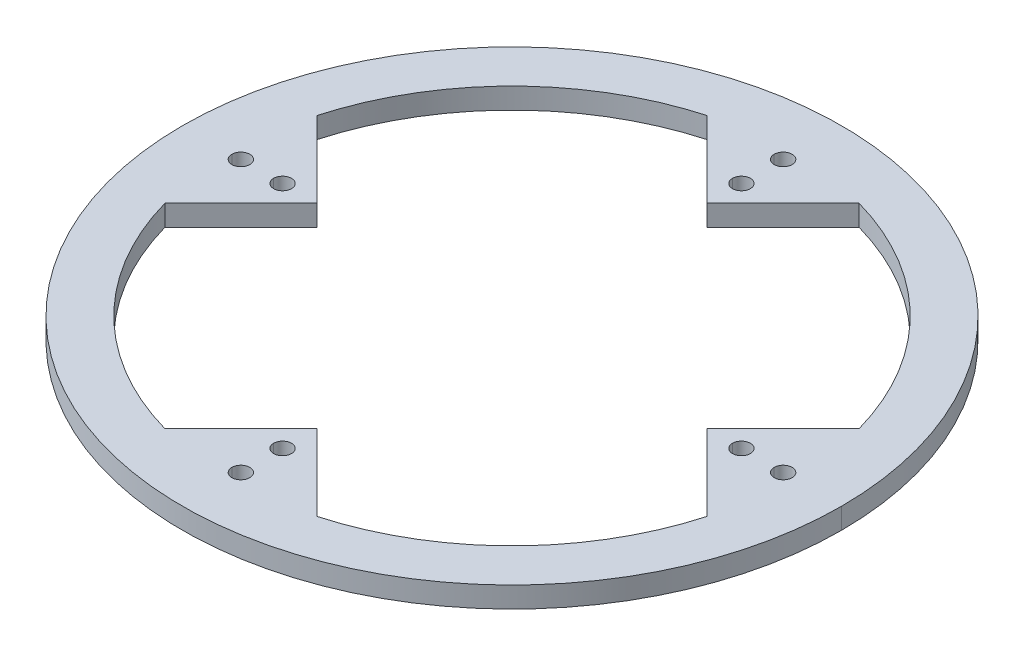
ISO-10303-21;
HEADER;
FILE_DESCRIPTION(('STEP AP214'),'2;1');
FILE_NAME('part.step','',(''),(''),'','','');
FILE_SCHEMA(('AUTOMOTIVE_DESIGN { 1 0 10303 214 1 1 1 1 }'));
ENDSEC;
DATA;
#1=APPLICATION_CONTEXT('core data for automotive mechanical design processes');
#2=APPLICATION_PROTOCOL_DEFINITION('international standard','automotive_design',2000,#1);
#3=PRODUCT_CONTEXT('',#1,'mechanical');
#4=PRODUCT('Part','Part','',(#3));
#5=PRODUCT_RELATED_PRODUCT_CATEGORY('part','',(#4));
#6=PRODUCT_DEFINITION_FORMATION('','',#4);
#7=PRODUCT_DEFINITION_CONTEXT('part definition',#1,'design');
#8=PRODUCT_DEFINITION('design','',#6,#7);
#9=PRODUCT_DEFINITION_SHAPE('','',#8);
#10=(LENGTH_UNIT() NAMED_UNIT(*) SI_UNIT(.MILLI.,.METRE.));
#11=(NAMED_UNIT(*) PLANE_ANGLE_UNIT() SI_UNIT($,.RADIAN.));
#12=(NAMED_UNIT(*) SI_UNIT($,.STERADIAN.) SOLID_ANGLE_UNIT());
#13=UNCERTAINTY_MEASURE_WITH_UNIT(LENGTH_MEASURE(1.E-05),#10,'distance_accuracy_value','');
#14=(GEOMETRIC_REPRESENTATION_CONTEXT(3) GLOBAL_UNCERTAINTY_ASSIGNED_CONTEXT((#13)) GLOBAL_UNIT_ASSIGNED_CONTEXT((#10,
#11,#12)) REPRESENTATION_CONTEXT('',''));
#15=CARTESIAN_POINT('',(0.,0.,0.));
#16=DIRECTION('',(0.,0.,1.));
#17=DIRECTION('',(1.,0.,0.));
#18=AXIS2_PLACEMENT_3D('',#15,#16,#17);
#19=CARTESIAN_POINT('',(65.,0.,-18.2002747232));
#20=DIRECTION('',(-0.707106781186548,0.,-0.707106781186548));
#21=DIRECTION('',(-0.707106781186548,0.,0.707106781186548));
#22=AXIS2_PLACEMENT_3D('',#19,#20,#21);
#23=PLANE('',#22);
#24=DIRECTION('',(0.,1.,0.));
#25=VECTOR('',#24,1.);
#26=CARTESIAN_POINT('',(46.7997252768,0.,0.));
#27=LINE('',#26,#25);
#28=CARTESIAN_POINT('',(46.7997252768,0.,0.));
#29=VERTEX_POINT('',#28);
#30=CARTESIAN_POINT('',(46.7997252768,5.,0.));
#31=VERTEX_POINT('',#30);
#32=EDGE_CURVE('E9',#29,#31,#27,.T.);
#33=ORIENTED_EDGE('',*,*,#32,.T.);
#34=DIRECTION('',(-0.707106781186548,0.,0.707106781186548));
#35=VECTOR('',#34,1.);
#36=CARTESIAN_POINT('',(65.,5.,-18.2002747232));
#37=LINE('',#36,#35);
#38=CARTESIAN_POINT('',(65.,5.,-18.2002747232));
#39=VERTEX_POINT('',#38);
#40=EDGE_CURVE('E281',#39,#31,#37,.T.);
#41=ORIENTED_EDGE('',*,*,#40,.F.);
#42=DIRECTION('',(0.,1.,0.));
#43=VECTOR('',#42,1.);
#44=CARTESIAN_POINT('',(65.,0.,-18.2002747232));
#45=LINE('',#44,#43);
#46=CARTESIAN_POINT('',(65.,0.,-18.2002747232));
#47=VERTEX_POINT('',#46);
#48=EDGE_CURVE('E351',#47,#39,#45,.T.);
#49=ORIENTED_EDGE('',*,*,#48,.F.);
#50=DIRECTION('',(-0.707106781186548,0.,0.707106781186548));
#51=VECTOR('',#50,1.);
#52=CARTESIAN_POINT('',(65.,0.,-18.2002747232));
#53=LINE('',#52,#51);
#54=EDGE_CURVE('E450',#47,#29,#53,.T.);
#55=ORIENTED_EDGE('',*,*,#54,.T.);
#56=EDGE_LOOP('',(#33,#41,#49,#55));
#57=FACE_BOUND('',#56,.T.);
#58=ADVANCED_FACE('F14',(#57),#23,.T.);
#59=CARTESIAN_POINT('',(46.7997252768,0.,0.));
#60=DIRECTION('',(-0.707106781186548,0.,0.707106781186548));
#61=DIRECTION('',(0.,1.,0.));
#62=AXIS2_PLACEMENT_3D('',#59,#60,#61);
#63=PLANE('',#62);
#64=DIRECTION('',(0.,1.,0.));
#65=VECTOR('',#64,1.);
#66=CARTESIAN_POINT('',(65.,0.,18.2002747232));
#67=LINE('',#66,#65);
#68=CARTESIAN_POINT('',(65.,0.,18.2002747232));
#69=VERTEX_POINT('',#68);
#70=CARTESIAN_POINT('',(65.,5.,18.2002747232));
#71=VERTEX_POINT('',#70);
#72=EDGE_CURVE('E25',#69,#71,#67,.T.);
#73=ORIENTED_EDGE('',*,*,#72,.T.);
#74=DIRECTION('',(0.707106781186548,0.,0.707106781186548));
#75=VECTOR('',#74,1.);
#76=CARTESIAN_POINT('',(46.7997252768,5.,0.));
#77=LINE('',#76,#75);
#78=EDGE_CURVE('E258',#31,#71,#77,.T.);
#79=ORIENTED_EDGE('',*,*,#78,.F.);
#80=ORIENTED_EDGE('',*,*,#32,.F.);
#81=DIRECTION('',(0.707106781186548,0.,0.707106781186548));
#82=VECTOR('',#81,1.);
#83=CARTESIAN_POINT('',(46.7997252768,0.,0.));
#84=LINE('',#83,#82);
#85=EDGE_CURVE('E261',#29,#69,#84,.T.);
#86=ORIENTED_EDGE('',*,*,#85,.T.);
#87=EDGE_LOOP('',(#73,#79,#80,#86));
#88=FACE_BOUND('',#87,.T.);
#89=ADVANCED_FACE('F256',(#88),#63,.T.);
#90=CARTESIAN_POINT('',(0.,0.,0.));
#91=DIRECTION('',(0.,1.,0.));
#92=DIRECTION('',(1.,0.,0.));
#93=AXIS2_PLACEMENT_3D('',#90,#91,#92);
#94=CYLINDRICAL_SURFACE('',#93,67.5);
#95=DIRECTION('',(0.,1.,0.));
#96=VECTOR('',#95,1.);
#97=CARTESIAN_POINT('',(18.2002747232,0.,65.));
#98=LINE('',#97,#96);
#99=CARTESIAN_POINT('',(18.2002747232,0.,65.));
#100=VERTEX_POINT('',#99);
#101=CARTESIAN_POINT('',(18.2002747232,5.,65.));
#102=VERTEX_POINT('',#101);
#103=EDGE_CURVE('E266',#100,#102,#98,.T.);
#104=ORIENTED_EDGE('',*,*,#103,.T.);
#105=CARTESIAN_POINT('',(0.,5.,0.));
#106=DIRECTION('',(0.,-1.,0.));
#107=DIRECTION('',(0.962962962962961,0.,0.269633699602989));
#108=AXIS2_PLACEMENT_3D('',#105,#106,#107);
#109=CIRCLE('',#108,67.5);
#110=EDGE_CURVE('E269',#71,#102,#109,.T.);
#111=ORIENTED_EDGE('',*,*,#110,.F.);
#112=ORIENTED_EDGE('',*,*,#72,.F.);
#113=CARTESIAN_POINT('',(0.,0.,0.));
#114=DIRECTION('',(0.,-1.,0.));
#115=DIRECTION('',(0.962962962962961,0.,0.269633699602989));
#116=AXIS2_PLACEMENT_3D('',#113,#114,#115);
#117=CIRCLE('',#116,67.5);
#118=EDGE_CURVE('E485',#69,#100,#117,.T.);
#119=ORIENTED_EDGE('',*,*,#118,.T.);
#120=EDGE_LOOP('',(#104,#111,#112,#119));
#121=FACE_BOUND('',#120,.T.);
#122=ADVANCED_FACE('F270',(#121),#94,.F.);
#123=CARTESIAN_POINT('',(18.2002747232,0.,65.));
#124=DIRECTION('',(0.707106781186548,0.,-0.707106781186548));
#125=DIRECTION('',(0.,-1.,0.));
#126=AXIS2_PLACEMENT_3D('',#123,#124,#125);
#127=PLANE('',#126);
#128=DIRECTION('',(0.,1.,0.));
#129=VECTOR('',#128,1.);
#130=CARTESIAN_POINT('',(0.,0.,46.7997252768));
#131=LINE('',#130,#129);
#132=CARTESIAN_POINT('',(0.,0.,46.7997252768));
#133=VERTEX_POINT('',#132);
#134=CARTESIAN_POINT('',(0.,5.,46.7997252768));
#135=VERTEX_POINT('',#134);
#136=EDGE_CURVE('E440',#133,#135,#131,.T.);
#137=ORIENTED_EDGE('',*,*,#136,.T.);
#138=DIRECTION('',(-0.707106781186548,0.,-0.707106781186548));
#139=VECTOR('',#138,1.);
#140=CARTESIAN_POINT('',(18.2002747232,5.,65.));
#141=LINE('',#140,#139);
#142=EDGE_CURVE('E275',#102,#135,#141,.T.);
#143=ORIENTED_EDGE('',*,*,#142,.F.);
#144=ORIENTED_EDGE('',*,*,#103,.F.);
#145=DIRECTION('',(-0.707106781186548,0.,-0.707106781186548));
#146=VECTOR('',#145,1.);
#147=CARTESIAN_POINT('',(18.2002747232,0.,65.));
#148=LINE('',#147,#146);
#149=EDGE_CURVE('E431',#100,#133,#148,.T.);
#150=ORIENTED_EDGE('',*,*,#149,.T.);
#151=EDGE_LOOP('',(#137,#143,#144,#150));
#152=FACE_BOUND('',#151,.T.);
#153=ADVANCED_FACE('F722',(#152),#127,.T.);
#154=CARTESIAN_POINT('',(0.,0.,46.7997252768));
#155=DIRECTION('',(-0.707106781186548,0.,-0.707106781186548));
#156=DIRECTION('',(-0.707106781186548,0.,0.707106781186548));
#157=AXIS2_PLACEMENT_3D('',#154,#155,#156);
#158=PLANE('',#157);
#159=DIRECTION('',(0.,1.,0.));
#160=VECTOR('',#159,1.);
#161=CARTESIAN_POINT('',(-18.2002747232,0.,65.));
#162=LINE('',#161,#160);
#163=CARTESIAN_POINT('',(-18.2002747232,0.,65.));
#164=VERTEX_POINT('',#163);
#165=CARTESIAN_POINT('',(-18.2002747232,5.,65.));
#166=VERTEX_POINT('',#165);
#167=EDGE_CURVE('E436',#164,#166,#162,.T.);
#168=ORIENTED_EDGE('',*,*,#167,.T.);
#169=DIRECTION('',(-0.707106781186548,0.,0.707106781186548));
#170=VECTOR('',#169,1.);
#171=CARTESIAN_POINT('',(0.,5.,46.7997252768));
#172=LINE('',#171,#170);
#173=EDGE_CURVE('E313',#135,#166,#172,.T.);
#174=ORIENTED_EDGE('',*,*,#173,.F.);
#175=ORIENTED_EDGE('',*,*,#136,.F.);
#176=DIRECTION('',(-0.707106781186548,0.,0.707106781186548));
#177=VECTOR('',#176,1.);
#178=CARTESIAN_POINT('',(0.,0.,46.7997252768));
#179=LINE('',#178,#177);
#180=EDGE_CURVE('E427',#133,#164,#179,.T.);
#181=ORIENTED_EDGE('',*,*,#180,.T.);
#182=EDGE_LOOP('',(#168,#174,#175,#181));
#183=FACE_BOUND('',#182,.T.);
#184=ADVANCED_FACE('F724',(#183),#158,.T.);
#185=CARTESIAN_POINT('',(0.,0.,0.));
#186=DIRECTION('',(0.,1.,0.));
#187=DIRECTION('',(1.,0.,0.));
#188=AXIS2_PLACEMENT_3D('',#185,#186,#187);
#189=CYLINDRICAL_SURFACE('',#188,67.5);
#190=DIRECTION('',(0.,1.,0.));
#191=VECTOR('',#190,1.);
#192=CARTESIAN_POINT('',(-65.,0.,18.2002747232));
#193=LINE('',#192,#191);
#194=CARTESIAN_POINT('',(-65.,0.,18.2002747232));
#195=VERTEX_POINT('',#194);
#196=CARTESIAN_POINT('',(-65.,5.,18.2002747232));
#197=VERTEX_POINT('',#196);
#198=EDGE_CURVE('E433',#195,#197,#193,.T.);
#199=ORIENTED_EDGE('',*,*,#198,.T.);
#200=CARTESIAN_POINT('',(0.,5.,0.));
#201=DIRECTION('',(0.,-1.,0.));
#202=DIRECTION('',(-0.269633699602989,0.,0.962962962962961));
#203=AXIS2_PLACEMENT_3D('',#200,#201,#202);
#204=CIRCLE('',#203,67.5);
#205=EDGE_CURVE('E317',#166,#197,#204,.T.);
#206=ORIENTED_EDGE('',*,*,#205,.F.);
#207=ORIENTED_EDGE('',*,*,#167,.F.);
#208=CARTESIAN_POINT('',(0.,0.,0.));
#209=DIRECTION('',(0.,-1.,0.));
#210=DIRECTION('',(-0.269633699602989,0.,0.962962962962961));
#211=AXIS2_PLACEMENT_3D('',#208,#209,#210);
#212=CIRCLE('',#211,67.5);
#213=EDGE_CURVE('E432',#164,#195,#212,.T.);
#214=ORIENTED_EDGE('',*,*,#213,.T.);
#215=EDGE_LOOP('',(#199,#206,#207,#214));
#216=FACE_BOUND('',#215,.T.);
#217=ADVANCED_FACE('F587',(#216),#189,.F.);
#218=CARTESIAN_POINT('',(-65.,0.,18.2002747232));
#219=DIRECTION('',(0.707106781186548,0.,0.707106781186548));
#220=DIRECTION('',(0.,-1.,0.));
#221=AXIS2_PLACEMENT_3D('',#218,#219,#220);
#222=PLANE('',#221);
#223=DIRECTION('',(0.,1.,0.));
#224=VECTOR('',#223,1.);
#225=CARTESIAN_POINT('',(-46.7997252768,0.,0.));
#226=LINE('',#225,#224);
#227=CARTESIAN_POINT('',(-46.7997252768,0.,0.));
#228=VERTEX_POINT('',#227);
#229=CARTESIAN_POINT('',(-46.7997252768,5.,0.));
#230=VERTEX_POINT('',#229);
#231=EDGE_CURVE('E437',#228,#230,#226,.T.);
#232=ORIENTED_EDGE('',*,*,#231,.T.);
#233=DIRECTION('',(0.707106781186548,0.,-0.707106781186548));
#234=VECTOR('',#233,1.);
#235=CARTESIAN_POINT('',(-65.,5.,18.2002747232));
#236=LINE('',#235,#234);
#237=EDGE_CURVE('E412',#197,#230,#236,.T.);
#238=ORIENTED_EDGE('',*,*,#237,.F.);
#239=ORIENTED_EDGE('',*,*,#198,.F.);
#240=DIRECTION('',(0.707106781186548,0.,-0.707106781186548));
#241=VECTOR('',#240,1.);
#242=CARTESIAN_POINT('',(-65.,0.,18.2002747232));
#243=LINE('',#242,#241);
#244=EDGE_CURVE('E374',#195,#228,#243,.T.);
#245=ORIENTED_EDGE('',*,*,#244,.T.);
#246=EDGE_LOOP('',(#232,#238,#239,#245));
#247=FACE_BOUND('',#246,.T.);
#248=ADVANCED_FACE('F578',(#247),#222,.T.);
#249=CARTESIAN_POINT('',(-46.7997252768,0.,0.));
#250=DIRECTION('',(0.707106781186548,0.,-0.707106781186548));
#251=DIRECTION('',(0.,-1.,0.));
#252=AXIS2_PLACEMENT_3D('',#249,#250,#251);
#253=PLANE('',#252);
#254=DIRECTION('',(0.,1.,0.));
#255=VECTOR('',#254,1.);
#256=CARTESIAN_POINT('',(-65.,0.,-18.2002747232));
#257=LINE('',#256,#255);
#258=CARTESIAN_POINT('',(-65.,0.,-18.2002747232));
#259=VERTEX_POINT('',#258);
#260=CARTESIAN_POINT('',(-65.,5.,-18.2002747232));
#261=VERTEX_POINT('',#260);
#262=EDGE_CURVE('E358',#259,#261,#257,.T.);
#263=ORIENTED_EDGE('',*,*,#262,.T.);
#264=DIRECTION('',(-0.707106781186548,0.,-0.707106781186548));
#265=VECTOR('',#264,1.);
#266=CARTESIAN_POINT('',(-46.7997252768,5.,0.));
#267=LINE('',#266,#265);
#268=EDGE_CURVE('E329',#230,#261,#267,.T.);
#269=ORIENTED_EDGE('',*,*,#268,.F.);
#270=ORIENTED_EDGE('',*,*,#231,.F.);
#271=DIRECTION('',(-0.707106781186548,0.,-0.707106781186548));
#272=VECTOR('',#271,1.);
#273=CARTESIAN_POINT('',(-46.7997252768,0.,0.));
#274=LINE('',#273,#272);
#275=EDGE_CURVE('E370',#228,#259,#274,.T.);
#276=ORIENTED_EDGE('',*,*,#275,.T.);
#277=EDGE_LOOP('',(#263,#269,#270,#276));
#278=FACE_BOUND('',#277,.T.);
#279=ADVANCED_FACE('F582',(#278),#253,.T.);
#280=CARTESIAN_POINT('',(0.,0.,0.));
#281=DIRECTION('',(0.,1.,0.));
#282=DIRECTION('',(1.,0.,0.));
#283=AXIS2_PLACEMENT_3D('',#280,#281,#282);
#284=CYLINDRICAL_SURFACE('',#283,67.5);
#285=DIRECTION('',(0.,1.,0.));
#286=VECTOR('',#285,1.);
#287=CARTESIAN_POINT('',(-18.2002747232,0.,-65.));
#288=LINE('',#287,#286);
#289=CARTESIAN_POINT('',(-18.2002747232,0.,-65.));
#290=VERTEX_POINT('',#289);
#291=CARTESIAN_POINT('',(-18.2002747232,5.,-65.));
#292=VERTEX_POINT('',#291);
#293=EDGE_CURVE('E355',#290,#292,#288,.T.);
#294=ORIENTED_EDGE('',*,*,#293,.T.);
#295=CARTESIAN_POINT('',(0.,5.,0.));
#296=DIRECTION('',(0.,-1.,0.));
#297=DIRECTION('',(-0.962962962962961,0.,-0.269633699602989));
#298=AXIS2_PLACEMENT_3D('',#295,#296,#297);
#299=CIRCLE('',#298,67.5);
#300=EDGE_CURVE('E324',#261,#292,#299,.T.);
#301=ORIENTED_EDGE('',*,*,#300,.F.);
#302=ORIENTED_EDGE('',*,*,#262,.F.);
#303=CARTESIAN_POINT('',(0.,0.,0.));
#304=DIRECTION('',(0.,-1.,0.));
#305=DIRECTION('',(-0.962962962962961,0.,-0.269633699602989));
#306=AXIS2_PLACEMENT_3D('',#303,#304,#305);
#307=CIRCLE('',#306,67.5);
#308=EDGE_CURVE('E375',#259,#290,#307,.T.);
#309=ORIENTED_EDGE('',*,*,#308,.T.);
#310=EDGE_LOOP('',(#294,#301,#302,#309));
#311=FACE_BOUND('',#310,.T.);
#312=ADVANCED_FACE('F599',(#311),#284,.F.);
#313=CARTESIAN_POINT('',(-18.2002747232,0.,-65.));
#314=DIRECTION('',(-0.707106781186548,0.,0.707106781186548));
#315=DIRECTION('',(0.,1.,0.));
#316=AXIS2_PLACEMENT_3D('',#313,#314,#315);
#317=PLANE('',#316);
#318=DIRECTION('',(0.,1.,0.));
#319=VECTOR('',#318,1.);
#320=CARTESIAN_POINT('',(0.,0.,-46.7997252768));
#321=LINE('',#320,#319);
#322=CARTESIAN_POINT('',(0.,0.,-46.7997252768));
#323=VERTEX_POINT('',#322);
#324=CARTESIAN_POINT('',(0.,5.,-46.7997252768));
#325=VERTEX_POINT('',#324);
#326=EDGE_CURVE('E359',#323,#325,#321,.T.);
#327=ORIENTED_EDGE('',*,*,#326,.T.);
#328=DIRECTION('',(0.707106781186548,0.,0.707106781186548));
#329=VECTOR('',#328,1.);
#330=CARTESIAN_POINT('',(-18.2002747232,5.,-65.));
#331=LINE('',#330,#329);
#332=EDGE_CURVE('E328',#292,#325,#331,.T.);
#333=ORIENTED_EDGE('',*,*,#332,.F.);
#334=ORIENTED_EDGE('',*,*,#293,.F.);
#335=DIRECTION('',(0.707106781186548,0.,0.707106781186548));
#336=VECTOR('',#335,1.);
#337=CARTESIAN_POINT('',(-18.2002747232,0.,-65.));
#338=LINE('',#337,#336);
#339=EDGE_CURVE('E395',#290,#323,#338,.T.);
#340=ORIENTED_EDGE('',*,*,#339,.T.);
#341=EDGE_LOOP('',(#327,#333,#334,#340));
#342=FACE_BOUND('',#341,.T.);
#343=ADVANCED_FACE('F603',(#342),#317,.T.);
#344=CARTESIAN_POINT('',(0.,0.,-46.7997252768));
#345=DIRECTION('',(0.707106781186548,0.,0.707106781186548));
#346=DIRECTION('',(0.,-1.,0.));
#347=AXIS2_PLACEMENT_3D('',#344,#345,#346);
#348=PLANE('',#347);
#349=DIRECTION('',(0.,1.,0.));
#350=VECTOR('',#349,1.);
#351=CARTESIAN_POINT('',(18.2002747232,0.,-65.));
#352=LINE('',#351,#350);
#353=CARTESIAN_POINT('',(18.2002747232,0.,-65.));
#354=VERTEX_POINT('',#353);
#355=CARTESIAN_POINT('',(18.2002747232,5.,-65.));
#356=VERTEX_POINT('',#355);
#357=EDGE_CURVE('E39',#354,#356,#352,.T.);
#358=ORIENTED_EDGE('',*,*,#357,.T.);
#359=DIRECTION('',(0.707106781186548,0.,-0.707106781186548));
#360=VECTOR('',#359,1.);
#361=CARTESIAN_POINT('',(0.,5.,-46.7997252768));
#362=LINE('',#361,#360);
#363=EDGE_CURVE('E18',#325,#356,#362,.T.);
#364=ORIENTED_EDGE('',*,*,#363,.F.);
#365=ORIENTED_EDGE('',*,*,#326,.F.);
#366=DIRECTION('',(0.707106781186548,0.,-0.707106781186548));
#367=VECTOR('',#366,1.);
#368=CARTESIAN_POINT('',(0.,0.,-46.7997252768));
#369=LINE('',#368,#367);
#370=EDGE_CURVE('E380',#323,#354,#369,.T.);
#371=ORIENTED_EDGE('',*,*,#370,.T.);
#372=EDGE_LOOP('',(#358,#364,#365,#371));
#373=FACE_BOUND('',#372,.T.);
#374=ADVANCED_FACE('F606',(#373),#348,.T.);
#375=CARTESIAN_POINT('',(0.,0.,0.));
#376=DIRECTION('',(0.,1.,0.));
#377=DIRECTION('',(1.,0.,0.));
#378=AXIS2_PLACEMENT_3D('',#375,#376,#377);
#379=CYLINDRICAL_SURFACE('',#378,67.5);
#380=ORIENTED_EDGE('',*,*,#48,.T.);
#381=CARTESIAN_POINT('',(0.,5.,0.));
#382=DIRECTION('',(0.,-1.,0.));
#383=DIRECTION('',(0.269633699602989,0.,-0.962962962962961));
#384=AXIS2_PLACEMENT_3D('',#381,#382,#383);
#385=CIRCLE('',#384,67.5);
#386=EDGE_CURVE('E292',#356,#39,#385,.T.);
#387=ORIENTED_EDGE('',*,*,#386,.F.);
#388=ORIENTED_EDGE('',*,*,#357,.F.);
#389=CARTESIAN_POINT('',(0.,0.,0.));
#390=DIRECTION('',(0.,-1.,0.));
#391=DIRECTION('',(0.269633699602989,0.,-0.962962962962961));
#392=AXIS2_PLACEMENT_3D('',#389,#390,#391);
#393=CIRCLE('',#392,67.5);
#394=EDGE_CURVE('E454',#354,#47,#393,.T.);
#395=ORIENTED_EDGE('',*,*,#394,.T.);
#396=EDGE_LOOP('',(#380,#387,#388,#395));
#397=FACE_BOUND('',#396,.T.);
#398=ADVANCED_FACE('F711',(#397),#379,.F.);
#399=CARTESIAN_POINT('',(-55.,0.,0.));
#400=DIRECTION('',(0.,1.,0.));
#401=DIRECTION('',(1.,0.,0.));
#402=AXIS2_PLACEMENT_3D('',#399,#400,#401);
#403=CYLINDRICAL_SURFACE('',#402,2.15);
#404=DIRECTION('',(0.,1.,0.));
#405=VECTOR('',#404,1.);
#406=CARTESIAN_POINT('',(-52.85,0.,0.));
#407=LINE('',#406,#405);
#408=CARTESIAN_POINT('',(-52.85,0.,0.));
#409=VERTEX_POINT('',#408);
#410=CARTESIAN_POINT('',(-52.85,5.,0.));
#411=VERTEX_POINT('',#410);
#412=EDGE_CURVE('E354',#409,#411,#407,.T.);
#413=ORIENTED_EDGE('',*,*,#412,.T.);
#414=CARTESIAN_POINT('',(-55.,5.,0.));
#415=DIRECTION('',(0.,-1.,0.));
#416=DIRECTION('',(-1.,0.,0.));
#417=AXIS2_PLACEMENT_3D('',#414,#415,#416);
#418=CIRCLE('',#417,2.15);
#419=CARTESIAN_POINT('',(-57.15,5.,0.));
#420=VERTEX_POINT('',#419);
#421=EDGE_CURVE('E388',#420,#411,#418,.T.);
#422=ORIENTED_EDGE('',*,*,#421,.F.);
#423=DIRECTION('',(0.,1.,0.));
#424=VECTOR('',#423,1.);
#425=CARTESIAN_POINT('',(-57.15,0.,0.));
#426=LINE('',#425,#424);
#427=CARTESIAN_POINT('',(-57.15,0.,0.));
#428=VERTEX_POINT('',#427);
#429=EDGE_CURVE('E344',#428,#420,#426,.T.);
#430=ORIENTED_EDGE('',*,*,#429,.F.);
#431=CARTESIAN_POINT('',(-55.,0.,0.));
#432=DIRECTION('',(0.,-1.,0.));
#433=DIRECTION('',(-1.,0.,0.));
#434=AXIS2_PLACEMENT_3D('',#431,#432,#433);
#435=CIRCLE('',#434,2.15);
#436=EDGE_CURVE('E381',#428,#409,#435,.T.);
#437=ORIENTED_EDGE('',*,*,#436,.T.);
#438=EDGE_LOOP('',(#413,#422,#430,#437));
#439=FACE_BOUND('',#438,.T.);
#440=ADVANCED_FACE('F708',(#439),#403,.F.);
#441=CARTESIAN_POINT('',(-55.,0.,0.));
#442=DIRECTION('',(0.,1.,0.));
#443=DIRECTION('',(1.,0.,0.));
#444=AXIS2_PLACEMENT_3D('',#441,#442,#443);
#445=CYLINDRICAL_SURFACE('',#444,2.15);
#446=ORIENTED_EDGE('',*,*,#429,.T.);
#447=CARTESIAN_POINT('',(-55.,5.,0.));
#448=DIRECTION('',(0.,-1.,0.));
#449=DIRECTION('',(1.,0.,0.));
#450=AXIS2_PLACEMENT_3D('',#447,#448,#449);
#451=CIRCLE('',#450,2.15);
#452=EDGE_CURVE('E288',#411,#420,#451,.T.);
#453=ORIENTED_EDGE('',*,*,#452,.F.);
#454=ORIENTED_EDGE('',*,*,#412,.F.);
#455=CARTESIAN_POINT('',(-55.,0.,0.));
#456=DIRECTION('',(0.,-1.,0.));
#457=DIRECTION('',(1.,0.,0.));
#458=AXIS2_PLACEMENT_3D('',#455,#456,#457);
#459=CIRCLE('',#458,2.15);
#460=EDGE_CURVE('E376',#409,#428,#459,.T.);
#461=ORIENTED_EDGE('',*,*,#460,.T.);
#462=EDGE_LOOP('',(#446,#453,#454,#461));
#463=FACE_BOUND('',#462,.T.);
#464=ADVANCED_FACE('F706',(#463),#445,.F.);
#465=CARTESIAN_POINT('',(0.,0.,55.));
#466=DIRECTION('',(0.,1.,0.));
#467=DIRECTION('',(1.,0.,0.));
#468=AXIS2_PLACEMENT_3D('',#465,#466,#467);
#469=CYLINDRICAL_SURFACE('',#468,2.15);
#470=DIRECTION('',(0.,1.,0.));
#471=VECTOR('',#470,1.);
#472=CARTESIAN_POINT('',(2.15,0.,55.));
#473=LINE('',#472,#471);
#474=CARTESIAN_POINT('',(2.15,0.,55.));
#475=VERTEX_POINT('',#474);
#476=CARTESIAN_POINT('',(2.15,5.,55.));
#477=VERTEX_POINT('',#476);
#478=EDGE_CURVE('E341',#475,#477,#473,.T.);
#479=ORIENTED_EDGE('',*,*,#478,.T.);
#480=CARTESIAN_POINT('',(0.,5.,55.));
#481=DIRECTION('',(0.,-1.,0.));
#482=DIRECTION('',(-1.,0.,0.));
#483=AXIS2_PLACEMENT_3D('',#480,#481,#482);
#484=CIRCLE('',#483,2.15);
#485=CARTESIAN_POINT('',(-2.15,5.,55.));
#486=VERTEX_POINT('',#485);
#487=EDGE_CURVE('E399',#486,#477,#484,.T.);
#488=ORIENTED_EDGE('',*,*,#487,.F.);
#489=DIRECTION('',(0.,1.,0.));
#490=VECTOR('',#489,1.);
#491=CARTESIAN_POINT('',(-2.15,0.,55.));
#492=LINE('',#491,#490);
#493=CARTESIAN_POINT('',(-2.15,0.,55.));
#494=VERTEX_POINT('',#493);
#495=EDGE_CURVE('E345',#494,#486,#492,.T.);
#496=ORIENTED_EDGE('',*,*,#495,.F.);
#497=CARTESIAN_POINT('',(0.,0.,55.));
#498=DIRECTION('',(0.,-1.,0.));
#499=DIRECTION('',(-1.,0.,0.));
#500=AXIS2_PLACEMENT_3D('',#497,#498,#499);
#501=CIRCLE('',#500,2.15);
#502=EDGE_CURVE('E448',#494,#475,#501,.T.);
#503=ORIENTED_EDGE('',*,*,#502,.T.);
#504=EDGE_LOOP('',(#479,#488,#496,#503));
#505=FACE_BOUND('',#504,.T.);
#506=ADVANCED_FACE('F702',(#505),#469,.F.);
#507=CARTESIAN_POINT('',(0.,0.,55.));
#508=DIRECTION('',(0.,1.,0.));
#509=DIRECTION('',(1.,0.,0.));
#510=AXIS2_PLACEMENT_3D('',#507,#508,#509);
#511=CYLINDRICAL_SURFACE('',#510,2.15);
#512=ORIENTED_EDGE('',*,*,#495,.T.);
#513=CARTESIAN_POINT('',(0.,5.,55.));
#514=DIRECTION('',(0.,-1.,0.));
#515=DIRECTION('',(1.,0.,0.));
#516=AXIS2_PLACEMENT_3D('',#513,#514,#515);
#517=CIRCLE('',#516,2.15);
#518=EDGE_CURVE('E392',#477,#486,#517,.T.);
#519=ORIENTED_EDGE('',*,*,#518,.F.);
#520=ORIENTED_EDGE('',*,*,#478,.F.);
#521=CARTESIAN_POINT('',(0.,0.,55.));
#522=DIRECTION('',(0.,-1.,0.));
#523=DIRECTION('',(1.,0.,0.));
#524=AXIS2_PLACEMENT_3D('',#521,#522,#523);
#525=CIRCLE('',#524,2.15);
#526=EDGE_CURVE('E465',#475,#494,#525,.T.);
#527=ORIENTED_EDGE('',*,*,#526,.T.);
#528=EDGE_LOOP('',(#512,#519,#520,#527));
#529=FACE_BOUND('',#528,.T.);
#530=ADVANCED_FACE('F705',(#529),#511,.F.);
#531=CARTESIAN_POINT('',(55.,0.,0.));
#532=DIRECTION('',(0.,1.,0.));
#533=DIRECTION('',(1.,0.,0.));
#534=AXIS2_PLACEMENT_3D('',#531,#532,#533);
#535=CYLINDRICAL_SURFACE('',#534,2.15);
#536=DIRECTION('',(0.,1.,0.));
#537=VECTOR('',#536,1.);
#538=CARTESIAN_POINT('',(57.15,0.,0.));
#539=LINE('',#538,#537);
#540=CARTESIAN_POINT('',(57.15,0.,0.));
#541=VERTEX_POINT('',#540);
#542=CARTESIAN_POINT('',(57.15,5.,0.));
#543=VERTEX_POINT('',#542);
#544=EDGE_CURVE('E333',#541,#543,#539,.T.);
#545=ORIENTED_EDGE('',*,*,#544,.T.);
#546=CARTESIAN_POINT('',(55.,5.,0.));
#547=DIRECTION('',(0.,-1.,0.));
#548=DIRECTION('',(-1.,0.,0.));
#549=AXIS2_PLACEMENT_3D('',#546,#547,#548);
#550=CIRCLE('',#549,2.15);
#551=CARTESIAN_POINT('',(52.85,5.,0.));
#552=VERTEX_POINT('',#551);
#553=EDGE_CURVE('E382',#552,#543,#550,.T.);
#554=ORIENTED_EDGE('',*,*,#553,.F.);
#555=DIRECTION('',(0.,1.,0.));
#556=VECTOR('',#555,1.);
#557=CARTESIAN_POINT('',(52.85,0.,0.));
#558=LINE('',#557,#556);
#559=CARTESIAN_POINT('',(52.85,0.,0.));
#560=VERTEX_POINT('',#559);
#561=EDGE_CURVE('E330',#560,#552,#558,.T.);
#562=ORIENTED_EDGE('',*,*,#561,.F.);
#563=CARTESIAN_POINT('',(55.,0.,0.));
#564=DIRECTION('',(0.,-1.,0.));
#565=DIRECTION('',(-1.,0.,0.));
#566=AXIS2_PLACEMENT_3D('',#563,#564,#565);
#567=CIRCLE('',#566,2.15);
#568=EDGE_CURVE('E449',#560,#541,#567,.T.);
#569=ORIENTED_EDGE('',*,*,#568,.T.);
#570=EDGE_LOOP('',(#545,#554,#562,#569));
#571=FACE_BOUND('',#570,.T.);
#572=ADVANCED_FACE('F700',(#571),#535,.F.);
#573=CARTESIAN_POINT('',(55.,0.,0.));
#574=DIRECTION('',(0.,1.,0.));
#575=DIRECTION('',(1.,0.,0.));
#576=AXIS2_PLACEMENT_3D('',#573,#574,#575);
#577=CYLINDRICAL_SURFACE('',#576,2.15);
#578=ORIENTED_EDGE('',*,*,#561,.T.);
#579=CARTESIAN_POINT('',(55.,5.,0.));
#580=DIRECTION('',(0.,-1.,0.));
#581=DIRECTION('',(1.,0.,0.));
#582=AXIS2_PLACEMENT_3D('',#579,#580,#581);
#583=CIRCLE('',#582,2.15);
#584=EDGE_CURVE('E386',#543,#552,#583,.T.);
#585=ORIENTED_EDGE('',*,*,#584,.F.);
#586=ORIENTED_EDGE('',*,*,#544,.F.);
#587=CARTESIAN_POINT('',(55.,0.,0.));
#588=DIRECTION('',(0.,-1.,0.));
#589=DIRECTION('',(1.,0.,0.));
#590=AXIS2_PLACEMENT_3D('',#587,#588,#589);
#591=CIRCLE('',#590,2.15);
#592=EDGE_CURVE('E444',#541,#560,#591,.T.);
#593=ORIENTED_EDGE('',*,*,#592,.T.);
#594=EDGE_LOOP('',(#578,#585,#586,#593));
#595=FACE_BOUND('',#594,.T.);
#596=ADVANCED_FACE('F696',(#595),#577,.F.);
#597=CARTESIAN_POINT('',(0.,0.,-55.));
#598=DIRECTION('',(0.,1.,0.));
#599=DIRECTION('',(1.,0.,0.));
#600=AXIS2_PLACEMENT_3D('',#597,#598,#599);
#601=CYLINDRICAL_SURFACE('',#600,2.15);
#602=DIRECTION('',(0.,1.,0.));
#603=VECTOR('',#602,1.);
#604=CARTESIAN_POINT('',(2.15,0.,-55.));
#605=LINE('',#604,#603);
#606=CARTESIAN_POINT('',(2.15,0.,-55.));
#607=VERTEX_POINT('',#606);
#608=CARTESIAN_POINT('',(2.15,5.,-55.));
#609=VERTEX_POINT('',#608);
#610=EDGE_CURVE('E334',#607,#609,#605,.T.);
#611=ORIENTED_EDGE('',*,*,#610,.T.);
#612=CARTESIAN_POINT('',(0.,5.,-55.));
#613=DIRECTION('',(0.,-1.,0.));
#614=DIRECTION('',(-1.,0.,0.));
#615=AXIS2_PLACEMENT_3D('',#612,#613,#614);
#616=CIRCLE('',#615,2.15);
#617=CARTESIAN_POINT('',(-2.15,5.,-55.));
#618=VERTEX_POINT('',#617);
#619=EDGE_CURVE('E311',#618,#609,#616,.T.);
#620=ORIENTED_EDGE('',*,*,#619,.F.);
#621=DIRECTION('',(0.,1.,0.));
#622=VECTOR('',#621,1.);
#623=CARTESIAN_POINT('',(-2.15,0.,-55.));
#624=LINE('',#623,#622);
#625=CARTESIAN_POINT('',(-2.15,0.,-55.));
#626=VERTEX_POINT('',#625);
#627=EDGE_CURVE('E306',#626,#618,#624,.T.);
#628=ORIENTED_EDGE('',*,*,#627,.F.);
#629=CARTESIAN_POINT('',(0.,0.,-55.));
#630=DIRECTION('',(0.,-1.,0.));
#631=DIRECTION('',(-1.,0.,0.));
#632=AXIS2_PLACEMENT_3D('',#629,#630,#631);
#633=CIRCLE('',#632,2.15);
#634=EDGE_CURVE('E318',#626,#607,#633,.T.);
#635=ORIENTED_EDGE('',*,*,#634,.T.);
#636=EDGE_LOOP('',(#611,#620,#628,#635));
#637=FACE_BOUND('',#636,.T.);
#638=ADVANCED_FACE('F699',(#637),#601,.F.);
#639=CARTESIAN_POINT('',(0.,0.,-55.));
#640=DIRECTION('',(0.,1.,0.));
#641=DIRECTION('',(1.,0.,0.));
#642=AXIS2_PLACEMENT_3D('',#639,#640,#641);
#643=CYLINDRICAL_SURFACE('',#642,2.15);
#644=ORIENTED_EDGE('',*,*,#627,.T.);
#645=CARTESIAN_POINT('',(0.,5.,-55.));
#646=DIRECTION('',(0.,-1.,0.));
#647=DIRECTION('',(1.,0.,0.));
#648=AXIS2_PLACEMENT_3D('',#645,#646,#647);
#649=CIRCLE('',#648,2.15);
#650=EDGE_CURVE('E387',#609,#618,#649,.T.);
#651=ORIENTED_EDGE('',*,*,#650,.F.);
#652=ORIENTED_EDGE('',*,*,#610,.F.);
#653=CARTESIAN_POINT('',(0.,0.,-55.));
#654=DIRECTION('',(0.,-1.,0.));
#655=DIRECTION('',(1.,0.,0.));
#656=AXIS2_PLACEMENT_3D('',#653,#654,#655);
#657=CIRCLE('',#656,2.15);
#658=EDGE_CURVE('E322',#607,#626,#657,.T.);
#659=ORIENTED_EDGE('',*,*,#658,.T.);
#660=EDGE_LOOP('',(#644,#651,#652,#659));
#661=FACE_BOUND('',#660,.T.);
#662=ADVANCED_FACE('F16',(#661),#643,.F.);
#663=CARTESIAN_POINT('',(-65.,0.,0.));
#664=DIRECTION('',(0.,1.,0.));
#665=DIRECTION('',(1.,0.,0.));
#666=AXIS2_PLACEMENT_3D('',#663,#664,#665);
#667=CYLINDRICAL_SURFACE('',#666,2.15);
#668=DIRECTION('',(0.,1.,0.));
#669=VECTOR('',#668,1.);
#670=CARTESIAN_POINT('',(-62.85,0.,0.));
#671=LINE('',#670,#669);
#672=CARTESIAN_POINT('',(-62.85,0.,0.));
#673=VERTEX_POINT('',#672);
#674=CARTESIAN_POINT('',(-62.85,5.,0.));
#675=VERTEX_POINT('',#674);
#676=EDGE_CURVE('E303',#673,#675,#671,.T.);
#677=ORIENTED_EDGE('',*,*,#676,.T.);
#678=CARTESIAN_POINT('',(-65.,5.,0.));
#679=DIRECTION('',(0.,-1.,0.));
#680=DIRECTION('',(-1.,0.,0.));
#681=AXIS2_PLACEMENT_3D('',#678,#679,#680);
#682=CIRCLE('',#681,2.15);
#683=CARTESIAN_POINT('',(-67.15,5.,0.));
#684=VERTEX_POINT('',#683);
#685=EDGE_CURVE('E312',#684,#675,#682,.T.);
#686=ORIENTED_EDGE('',*,*,#685,.F.);
#687=DIRECTION('',(0.,1.,0.));
#688=VECTOR('',#687,1.);
#689=CARTESIAN_POINT('',(-67.15,0.,0.));
#690=LINE('',#689,#688);
#691=CARTESIAN_POINT('',(-67.15,0.,0.));
#692=VERTEX_POINT('',#691);
#693=EDGE_CURVE('E301',#692,#684,#690,.T.);
#694=ORIENTED_EDGE('',*,*,#693,.F.);
#695=CARTESIAN_POINT('',(-65.,0.,0.));
#696=DIRECTION('',(0.,-1.,0.));
#697=DIRECTION('',(-1.,0.,0.));
#698=AXIS2_PLACEMENT_3D('',#695,#696,#697);
#699=CIRCLE('',#698,2.15);
#700=EDGE_CURVE('E457',#692,#673,#699,.T.);
#701=ORIENTED_EDGE('',*,*,#700,.T.);
#702=EDGE_LOOP('',(#677,#686,#694,#701));
#703=FACE_BOUND('',#702,.T.);
#704=ADVANCED_FACE('F741',(#703),#667,.F.);
#705=CARTESIAN_POINT('',(-65.,0.,0.));
#706=DIRECTION('',(0.,1.,0.));
#707=DIRECTION('',(1.,0.,0.));
#708=AXIS2_PLACEMENT_3D('',#705,#706,#707);
#709=CYLINDRICAL_SURFACE('',#708,2.15);
#710=ORIENTED_EDGE('',*,*,#693,.T.);
#711=CARTESIAN_POINT('',(-65.,5.,0.));
#712=DIRECTION('',(0.,-1.,0.));
#713=DIRECTION('',(1.,0.,0.));
#714=AXIS2_PLACEMENT_3D('',#711,#712,#713);
#715=CIRCLE('',#714,2.15);
#716=EDGE_CURVE('E307',#675,#684,#715,.T.);
#717=ORIENTED_EDGE('',*,*,#716,.F.);
#718=ORIENTED_EDGE('',*,*,#676,.F.);
#719=CARTESIAN_POINT('',(-65.,0.,0.));
#720=DIRECTION('',(0.,-1.,0.));
#721=DIRECTION('',(1.,0.,0.));
#722=AXIS2_PLACEMENT_3D('',#719,#720,#721);
#723=CIRCLE('',#722,2.15);
#724=EDGE_CURVE('E323',#673,#692,#723,.T.);
#725=ORIENTED_EDGE('',*,*,#724,.T.);
#726=EDGE_LOOP('',(#710,#717,#718,#725));
#727=FACE_BOUND('',#726,.T.);
#728=ADVANCED_FACE('F717',(#727),#709,.F.);
#729=CARTESIAN_POINT('',(0.,0.,65.));
#730=DIRECTION('',(0.,1.,0.));
#731=DIRECTION('',(1.,0.,0.));
#732=AXIS2_PLACEMENT_3D('',#729,#730,#731);
#733=CYLINDRICAL_SURFACE('',#732,2.15);
#734=DIRECTION('',(0.,1.,0.));
#735=VECTOR('',#734,1.);
#736=CARTESIAN_POINT('',(2.15,0.,65.));
#737=LINE('',#736,#735);
#738=CARTESIAN_POINT('',(2.15,0.,65.));
#739=VERTEX_POINT('',#738);
#740=CARTESIAN_POINT('',(2.15,5.,65.));
#741=VERTEX_POINT('',#740);
#742=EDGE_CURVE('E298',#739,#741,#737,.T.);
#743=ORIENTED_EDGE('',*,*,#742,.T.);
#744=CARTESIAN_POINT('',(0.,5.,65.));
#745=DIRECTION('',(0.,-1.,0.));
#746=DIRECTION('',(-1.,0.,0.));
#747=AXIS2_PLACEMENT_3D('',#744,#745,#746);
#748=CIRCLE('',#747,2.15);
#749=CARTESIAN_POINT('',(-2.15,5.,65.));
#750=VERTEX_POINT('',#749);
#751=EDGE_CURVE('E363',#750,#741,#748,.T.);
#752=ORIENTED_EDGE('',*,*,#751,.F.);
#753=DIRECTION('',(0.,1.,0.));
#754=VECTOR('',#753,1.);
#755=CARTESIAN_POINT('',(-2.15,0.,65.));
#756=LINE('',#755,#754);
#757=CARTESIAN_POINT('',(-2.15,0.,65.));
#758=VERTEX_POINT('',#757);
#759=EDGE_CURVE('E302',#758,#750,#756,.T.);
#760=ORIENTED_EDGE('',*,*,#759,.F.);
#761=CARTESIAN_POINT('',(0.,0.,65.));
#762=DIRECTION('',(0.,-1.,0.));
#763=DIRECTION('',(-1.,0.,0.));
#764=AXIS2_PLACEMENT_3D('',#761,#762,#763);
#765=CIRCLE('',#764,2.15);
#766=EDGE_CURVE('E566',#758,#739,#765,.T.);
#767=ORIENTED_EDGE('',*,*,#766,.T.);
#768=EDGE_LOOP('',(#743,#752,#760,#767));
#769=FACE_BOUND('',#768,.T.);
#770=ADVANCED_FACE('F713',(#769),#733,.F.);
#771=CARTESIAN_POINT('',(0.,0.,65.));
#772=DIRECTION('',(0.,1.,0.));
#773=DIRECTION('',(1.,0.,0.));
#774=AXIS2_PLACEMENT_3D('',#771,#772,#773);
#775=CYLINDRICAL_SURFACE('',#774,2.15);
#776=ORIENTED_EDGE('',*,*,#759,.T.);
#777=CARTESIAN_POINT('',(0.,5.,65.));
#778=DIRECTION('',(0.,-1.,0.));
#779=DIRECTION('',(1.,0.,0.));
#780=AXIS2_PLACEMENT_3D('',#777,#778,#779);
#781=CIRCLE('',#780,2.15);
#782=EDGE_CURVE('E360',#741,#750,#781,.T.);
#783=ORIENTED_EDGE('',*,*,#782,.F.);
#784=ORIENTED_EDGE('',*,*,#742,.F.);
#785=CARTESIAN_POINT('',(0.,0.,65.));
#786=DIRECTION('',(0.,-1.,0.));
#787=DIRECTION('',(1.,0.,0.));
#788=AXIS2_PLACEMENT_3D('',#785,#786,#787);
#789=CIRCLE('',#788,2.15);
#790=EDGE_CURVE('E461',#739,#758,#789,.T.);
#791=ORIENTED_EDGE('',*,*,#790,.T.);
#792=EDGE_LOOP('',(#776,#783,#784,#791));
#793=FACE_BOUND('',#792,.T.);
#794=ADVANCED_FACE('F716',(#793),#775,.F.);
#795=CARTESIAN_POINT('',(65.,0.,0.));
#796=DIRECTION('',(0.,1.,0.));
#797=DIRECTION('',(1.,0.,0.));
#798=AXIS2_PLACEMENT_3D('',#795,#796,#797);
#799=CYLINDRICAL_SURFACE('',#798,2.15);
#800=DIRECTION('',(0.,1.,0.));
#801=VECTOR('',#800,1.);
#802=CARTESIAN_POINT('',(67.15,0.,0.));
#803=LINE('',#802,#801);
#804=CARTESIAN_POINT('',(67.15,0.,0.));
#805=VERTEX_POINT('',#804);
#806=CARTESIAN_POINT('',(67.15,5.,0.));
#807=VERTEX_POINT('',#806);
#808=EDGE_CURVE('E424',#805,#807,#803,.T.);
#809=ORIENTED_EDGE('',*,*,#808,.T.);
#810=CARTESIAN_POINT('',(65.,5.,0.));
#811=DIRECTION('',(0.,-1.,0.));
#812=DIRECTION('',(-1.,0.,0.));
#813=AXIS2_PLACEMENT_3D('',#810,#811,#812);
#814=CIRCLE('',#813,2.15);
#815=CARTESIAN_POINT('',(62.85,5.,0.));
#816=VERTEX_POINT('',#815);
#817=EDGE_CURVE('E524',#816,#807,#814,.T.);
#818=ORIENTED_EDGE('',*,*,#817,.F.);
#819=DIRECTION('',(0.,1.,0.));
#820=VECTOR('',#819,1.);
#821=CARTESIAN_POINT('',(62.85,0.,0.));
#822=LINE('',#821,#820);
#823=CARTESIAN_POINT('',(62.85,0.,0.));
#824=VERTEX_POINT('',#823);
#825=EDGE_CURVE('E296',#824,#816,#822,.T.);
#826=ORIENTED_EDGE('',*,*,#825,.F.);
#827=CARTESIAN_POINT('',(65.,0.,0.));
#828=DIRECTION('',(0.,-1.,0.));
#829=DIRECTION('',(-1.,0.,0.));
#830=AXIS2_PLACEMENT_3D('',#827,#828,#829);
#831=CIRCLE('',#830,2.15);
#832=EDGE_CURVE('E549',#824,#805,#831,.T.);
#833=ORIENTED_EDGE('',*,*,#832,.T.);
#834=EDGE_LOOP('',(#809,#818,#826,#833));
#835=FACE_BOUND('',#834,.T.);
#836=ADVANCED_FACE('F668',(#835),#799,.F.);
#837=CARTESIAN_POINT('',(65.,0.,0.));
#838=DIRECTION('',(0.,1.,0.));
#839=DIRECTION('',(1.,0.,0.));
#840=AXIS2_PLACEMENT_3D('',#837,#838,#839);
#841=CYLINDRICAL_SURFACE('',#840,2.15);
#842=ORIENTED_EDGE('',*,*,#825,.T.);
#843=CARTESIAN_POINT('',(65.,5.,0.));
#844=DIRECTION('',(0.,-1.,0.));
#845=DIRECTION('',(1.,0.,0.));
#846=AXIS2_PLACEMENT_3D('',#843,#844,#845);
#847=CIRCLE('',#846,2.15);
#848=EDGE_CURVE('E473',#807,#816,#847,.T.);
#849=ORIENTED_EDGE('',*,*,#848,.F.);
#850=ORIENTED_EDGE('',*,*,#808,.F.);
#851=CARTESIAN_POINT('',(65.,0.,0.));
#852=DIRECTION('',(0.,-1.,0.));
#853=DIRECTION('',(1.,0.,0.));
#854=AXIS2_PLACEMENT_3D('',#851,#852,#853);
#855=CIRCLE('',#854,2.15);
#856=EDGE_CURVE('E553',#805,#824,#855,.T.);
#857=ORIENTED_EDGE('',*,*,#856,.T.);
#858=EDGE_LOOP('',(#842,#849,#850,#857));
#859=FACE_BOUND('',#858,.T.);
#860=ADVANCED_FACE('F673',(#859),#841,.F.);
#861=CARTESIAN_POINT('',(0.,0.,-65.));
#862=DIRECTION('',(0.,1.,0.));
#863=DIRECTION('',(1.,0.,0.));
#864=AXIS2_PLACEMENT_3D('',#861,#862,#863);
#865=CYLINDRICAL_SURFACE('',#864,2.15);
#866=DIRECTION('',(0.,1.,0.));
#867=VECTOR('',#866,1.);
#868=CARTESIAN_POINT('',(2.15,0.,-65.));
#869=LINE('',#868,#867);
#870=CARTESIAN_POINT('',(2.15,0.,-65.));
#871=VERTEX_POINT('',#870);
#872=CARTESIAN_POINT('',(2.15,5.,-65.));
#873=VERTEX_POINT('',#872);
#874=EDGE_CURVE('E294',#871,#873,#869,.T.);
#875=ORIENTED_EDGE('',*,*,#874,.T.);
#876=CARTESIAN_POINT('',(0.,5.,-65.));
#877=DIRECTION('',(0.,-1.,0.));
#878=DIRECTION('',(-1.,0.,0.));
#879=AXIS2_PLACEMENT_3D('',#876,#877,#878);
#880=CIRCLE('',#879,2.15);
#881=CARTESIAN_POINT('',(-2.15,5.,-65.));
#882=VERTEX_POINT('',#881);
#883=EDGE_CURVE('E335',#882,#873,#880,.T.);
#884=ORIENTED_EDGE('',*,*,#883,.F.);
#885=DIRECTION('',(0.,1.,0.));
#886=VECTOR('',#885,1.);
#887=CARTESIAN_POINT('',(-2.15,0.,-65.));
#888=LINE('',#887,#886);
#889=CARTESIAN_POINT('',(-2.15,0.,-65.));
#890=VERTEX_POINT('',#889);
#891=EDGE_CURVE('E297',#890,#882,#888,.T.);
#892=ORIENTED_EDGE('',*,*,#891,.F.);
#893=CARTESIAN_POINT('',(0.,0.,-65.));
#894=DIRECTION('',(0.,-1.,0.));
#895=DIRECTION('',(-1.,0.,0.));
#896=AXIS2_PLACEMENT_3D('',#893,#894,#895);
#897=CIRCLE('',#896,2.15);
#898=EDGE_CURVE('E416',#890,#871,#897,.T.);
#899=ORIENTED_EDGE('',*,*,#898,.T.);
#900=EDGE_LOOP('',(#875,#884,#892,#899));
#901=FACE_BOUND('',#900,.T.);
#902=ADVANCED_FACE('F638',(#901),#865,.F.);
#903=CARTESIAN_POINT('',(0.,0.,-65.));
#904=DIRECTION('',(0.,1.,0.));
#905=DIRECTION('',(1.,0.,0.));
#906=AXIS2_PLACEMENT_3D('',#903,#904,#905);
#907=CYLINDRICAL_SURFACE('',#906,2.15);
#908=ORIENTED_EDGE('',*,*,#891,.T.);
#909=CARTESIAN_POINT('',(0.,5.,-65.));
#910=DIRECTION('',(0.,-1.,0.));
#911=DIRECTION('',(1.,0.,0.));
#912=AXIS2_PLACEMENT_3D('',#909,#910,#911);
#913=CIRCLE('',#912,2.15);
#914=EDGE_CURVE('E339',#873,#882,#913,.T.);
#915=ORIENTED_EDGE('',*,*,#914,.F.);
#916=ORIENTED_EDGE('',*,*,#874,.F.);
#917=CARTESIAN_POINT('',(0.,0.,-65.));
#918=DIRECTION('',(0.,-1.,0.));
#919=DIRECTION('',(1.,0.,0.));
#920=AXIS2_PLACEMENT_3D('',#917,#918,#919);
#921=CIRCLE('',#920,2.15);
#922=EDGE_CURVE('E420',#871,#890,#921,.T.);
#923=ORIENTED_EDGE('',*,*,#922,.T.);
#924=EDGE_LOOP('',(#908,#915,#916,#923));
#925=FACE_BOUND('',#924,.T.);
#926=ADVANCED_FACE('F630',(#925),#907,.F.);
#927=CARTESIAN_POINT('',(0.,5.,0.));
#928=DIRECTION('',(0.,1.,0.));
#929=DIRECTION('',(1.,0.,0.));
#930=AXIS2_PLACEMENT_3D('',#927,#928,#929);
#931=PLANE('',#930);
#932=ORIENTED_EDGE('',*,*,#40,.T.);
#933=ORIENTED_EDGE('',*,*,#78,.T.);
#934=ORIENTED_EDGE('',*,*,#110,.T.);
#935=ORIENTED_EDGE('',*,*,#142,.T.);
#936=ORIENTED_EDGE('',*,*,#173,.T.);
#937=ORIENTED_EDGE('',*,*,#205,.T.);
#938=ORIENTED_EDGE('',*,*,#237,.T.);
#939=ORIENTED_EDGE('',*,*,#268,.T.);
#940=ORIENTED_EDGE('',*,*,#300,.T.);
#941=ORIENTED_EDGE('',*,*,#332,.T.);
#942=ORIENTED_EDGE('',*,*,#363,.T.);
#943=ORIENTED_EDGE('',*,*,#386,.T.);
#944=EDGE_LOOP('',(#932,#933,#934,#935,#936,#937,#938,#939,#940,#941,#942,#943));
#945=FACE_BOUND('',#944,.T.);
#946=ORIENTED_EDGE('',*,*,#421,.T.);
#947=ORIENTED_EDGE('',*,*,#452,.T.);
#948=EDGE_LOOP('',(#946,#947));
#949=FACE_BOUND('',#948,.T.);
#950=ORIENTED_EDGE('',*,*,#487,.T.);
#951=ORIENTED_EDGE('',*,*,#518,.T.);
#952=EDGE_LOOP('',(#950,#951));
#953=FACE_BOUND('',#952,.T.);
#954=ORIENTED_EDGE('',*,*,#553,.T.);
#955=ORIENTED_EDGE('',*,*,#584,.T.);
#956=EDGE_LOOP('',(#954,#955));
#957=FACE_BOUND('',#956,.T.);
#958=ORIENTED_EDGE('',*,*,#619,.T.);
#959=ORIENTED_EDGE('',*,*,#650,.T.);
#960=EDGE_LOOP('',(#958,#959));
#961=FACE_BOUND('',#960,.T.);
#962=ORIENTED_EDGE('',*,*,#685,.T.);
#963=ORIENTED_EDGE('',*,*,#716,.T.);
#964=EDGE_LOOP('',(#962,#963));
#965=FACE_BOUND('',#964,.T.);
#966=ORIENTED_EDGE('',*,*,#751,.T.);
#967=ORIENTED_EDGE('',*,*,#782,.T.);
#968=EDGE_LOOP('',(#966,#967));
#969=FACE_BOUND('',#968,.T.);
#970=ORIENTED_EDGE('',*,*,#817,.T.);
#971=ORIENTED_EDGE('',*,*,#848,.T.);
#972=EDGE_LOOP('',(#970,#971));
#973=FACE_BOUND('',#972,.T.);
#974=ORIENTED_EDGE('',*,*,#883,.T.);
#975=ORIENTED_EDGE('',*,*,#914,.T.);
#976=EDGE_LOOP('',(#974,#975));
#977=FACE_BOUND('',#976,.T.);
#978=CARTESIAN_POINT('',(0.,5.,0.));
#979=DIRECTION('',(0.,1.,0.));
#980=DIRECTION('',(-1.,0.,0.));
#981=AXIS2_PLACEMENT_3D('',#978,#979,#980);
#982=CIRCLE('',#981,79.);
#983=CARTESIAN_POINT('',(-79.,5.,0.));
#984=VERTEX_POINT('',#983);
#985=CARTESIAN_POINT('',(79.,5.,0.));
#986=VERTEX_POINT('',#985);
#987=EDGE_CURVE('E340',#984,#986,#982,.T.);
#988=ORIENTED_EDGE('',*,*,#987,.T.);
#989=CARTESIAN_POINT('',(0.,5.,0.));
#990=DIRECTION('',(0.,1.,0.));
#991=DIRECTION('',(1.,0.,0.));
#992=AXIS2_PLACEMENT_3D('',#989,#990,#991);
#993=CIRCLE('',#992,79.);
#994=EDGE_CURVE('E369',#986,#984,#993,.T.);
#995=ORIENTED_EDGE('',*,*,#994,.T.);
#996=EDGE_LOOP('',(#988,#995));
#997=FACE_BOUND('',#996,.T.);
#998=ADVANCED_FACE('F277',(#945,#949,#953,#957,#961,#965,#969,#973,#977,#997),#931,.T.);
#999=CARTESIAN_POINT('',(0.,0.,0.));
#1000=DIRECTION('',(0.,1.,0.));
#1001=DIRECTION('',(1.,0.,0.));
#1002=AXIS2_PLACEMENT_3D('',#999,#1000,#1001);
#1003=CYLINDRICAL_SURFACE('',#1002,79.);
#1004=DIRECTION('',(0.,1.,0.));
#1005=VECTOR('',#1004,1.);
#1006=CARTESIAN_POINT('',(79.,0.,0.));
#1007=LINE('',#1006,#1005);
#1008=CARTESIAN_POINT('',(79.,0.,0.));
#1009=VERTEX_POINT('',#1008);
#1010=EDGE_CURVE('E365',#1009,#986,#1007,.T.);
#1011=ORIENTED_EDGE('',*,*,#1010,.T.);
#1012=ORIENTED_EDGE('',*,*,#987,.F.);
#1013=DIRECTION('',(0.,1.,0.));
#1014=VECTOR('',#1013,1.);
#1015=CARTESIAN_POINT('',(-79.,0.,0.));
#1016=LINE('',#1015,#1014);
#1017=CARTESIAN_POINT('',(-79.,0.,0.));
#1018=VERTEX_POINT('',#1017);
#1019=EDGE_CURVE('E403',#1018,#984,#1016,.T.);
#1020=ORIENTED_EDGE('',*,*,#1019,.F.);
#1021=CARTESIAN_POINT('',(0.,0.,0.));
#1022=DIRECTION('',(0.,1.,0.));
#1023=DIRECTION('',(-1.,0.,0.));
#1024=AXIS2_PLACEMENT_3D('',#1021,#1022,#1023);
#1025=CIRCLE('',#1024,79.);
#1026=EDGE_CURVE('E469',#1018,#1009,#1025,.T.);
#1027=ORIENTED_EDGE('',*,*,#1026,.T.);
#1028=EDGE_LOOP('',(#1011,#1012,#1020,#1027));
#1029=FACE_BOUND('',#1028,.T.);
#1030=ADVANCED_FACE('F643',(#1029),#1003,.T.);
#1031=CARTESIAN_POINT('',(0.,0.,0.));
#1032=DIRECTION('',(0.,1.,0.));
#1033=DIRECTION('',(1.,0.,0.));
#1034=AXIS2_PLACEMENT_3D('',#1031,#1032,#1033);
#1035=CYLINDRICAL_SURFACE('',#1034,79.);
#1036=ORIENTED_EDGE('',*,*,#1019,.T.);
#1037=ORIENTED_EDGE('',*,*,#994,.F.);
#1038=ORIENTED_EDGE('',*,*,#1010,.F.);
#1039=CARTESIAN_POINT('',(0.,0.,0.));
#1040=DIRECTION('',(0.,1.,0.));
#1041=DIRECTION('',(1.,0.,0.));
#1042=AXIS2_PLACEMENT_3D('',#1039,#1040,#1041);
#1043=CIRCLE('',#1042,79.);
#1044=EDGE_CURVE('E421',#1009,#1018,#1043,.T.);
#1045=ORIENTED_EDGE('',*,*,#1044,.T.);
#1046=EDGE_LOOP('',(#1036,#1037,#1038,#1045));
#1047=FACE_BOUND('',#1046,.T.);
#1048=ADVANCED_FACE('F652',(#1047),#1035,.T.);
#1049=CARTESIAN_POINT('',(0.,0.,0.));
#1050=DIRECTION('',(0.,1.,0.));
#1051=DIRECTION('',(1.,0.,0.));
#1052=AXIS2_PLACEMENT_3D('',#1049,#1050,#1051);
#1053=PLANE('',#1052);
#1054=ORIENTED_EDGE('',*,*,#370,.F.);
#1055=ORIENTED_EDGE('',*,*,#339,.F.);
#1056=ORIENTED_EDGE('',*,*,#308,.F.);
#1057=ORIENTED_EDGE('',*,*,#275,.F.);
#1058=ORIENTED_EDGE('',*,*,#244,.F.);
#1059=ORIENTED_EDGE('',*,*,#213,.F.);
#1060=ORIENTED_EDGE('',*,*,#180,.F.);
#1061=ORIENTED_EDGE('',*,*,#149,.F.);
#1062=ORIENTED_EDGE('',*,*,#118,.F.);
#1063=ORIENTED_EDGE('',*,*,#85,.F.);
#1064=ORIENTED_EDGE('',*,*,#54,.F.);
#1065=ORIENTED_EDGE('',*,*,#394,.F.);
#1066=EDGE_LOOP('',(#1054,#1055,#1056,#1057,#1058,#1059,#1060,#1061,#1062,#1063,#1064,#1065));
#1067=FACE_BOUND('',#1066,.T.);
#1068=ORIENTED_EDGE('',*,*,#436,.F.);
#1069=ORIENTED_EDGE('',*,*,#460,.F.);
#1070=EDGE_LOOP('',(#1068,#1069));
#1071=FACE_BOUND('',#1070,.T.);
#1072=ORIENTED_EDGE('',*,*,#502,.F.);
#1073=ORIENTED_EDGE('',*,*,#526,.F.);
#1074=EDGE_LOOP('',(#1072,#1073));
#1075=FACE_BOUND('',#1074,.T.);
#1076=ORIENTED_EDGE('',*,*,#568,.F.);
#1077=ORIENTED_EDGE('',*,*,#592,.F.);
#1078=EDGE_LOOP('',(#1076,#1077));
#1079=FACE_BOUND('',#1078,.T.);
#1080=ORIENTED_EDGE('',*,*,#634,.F.);
#1081=ORIENTED_EDGE('',*,*,#658,.F.);
#1082=EDGE_LOOP('',(#1080,#1081));
#1083=FACE_BOUND('',#1082,.T.);
#1084=ORIENTED_EDGE('',*,*,#700,.F.);
#1085=ORIENTED_EDGE('',*,*,#724,.F.);
#1086=EDGE_LOOP('',(#1084,#1085));
#1087=FACE_BOUND('',#1086,.T.);
#1088=ORIENTED_EDGE('',*,*,#766,.F.);
#1089=ORIENTED_EDGE('',*,*,#790,.F.);
#1090=EDGE_LOOP('',(#1088,#1089));
#1091=FACE_BOUND('',#1090,.T.);
#1092=ORIENTED_EDGE('',*,*,#832,.F.);
#1093=ORIENTED_EDGE('',*,*,#856,.F.);
#1094=EDGE_LOOP('',(#1092,#1093));
#1095=FACE_BOUND('',#1094,.T.);
#1096=ORIENTED_EDGE('',*,*,#898,.F.);
#1097=ORIENTED_EDGE('',*,*,#922,.F.);
#1098=EDGE_LOOP('',(#1096,#1097));
#1099=FACE_BOUND('',#1098,.T.);
#1100=ORIENTED_EDGE('',*,*,#1026,.F.);
#1101=ORIENTED_EDGE('',*,*,#1044,.F.);
#1102=EDGE_LOOP('',(#1100,#1101));
#1103=FACE_BOUND('',#1102,.T.);
#1104=ADVANCED_FACE('F594',(#1067,#1071,#1075,#1079,#1083,#1087,#1091,#1095,#1099,#1103),#1053,.F.);
#1105=CLOSED_SHELL('',(#58,#89,#122,#153,#184,#217,#248,#279,#312,#343,#374,#398,#440,#464,#506,
#530,#572,#596,#638,#662,#704,#728,#770,#794,#836,#860,#902,#926,#998,#1030,#1048,#1104));
#1106=MANIFOLD_SOLID_BREP('B1',#1105);
#1107=ADVANCED_BREP_SHAPE_REPRESENTATION('',(#18,#1106),#14);
#1108=SHAPE_DEFINITION_REPRESENTATION(#9,#1107);
ENDSEC;
END-ISO-10303-21;
